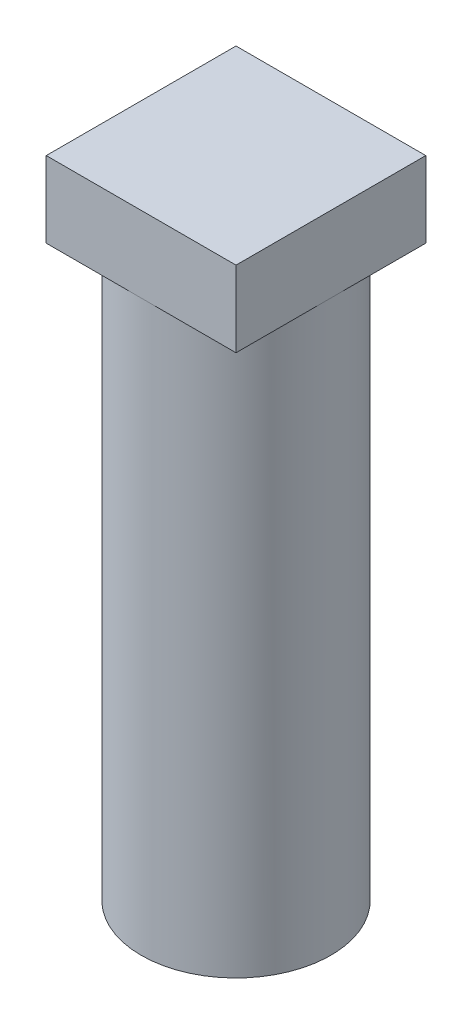
ISO-10303-21;
HEADER;
FILE_DESCRIPTION(('STEP AP214'),'2;1');
FILE_NAME('part.step','',(''),(''),'','','');
FILE_SCHEMA(('AUTOMOTIVE_DESIGN { 1 0 10303 214 1 1 1 1 }'));
ENDSEC;
DATA;
#1=APPLICATION_CONTEXT('core data for automotive mechanical design processes');
#2=APPLICATION_PROTOCOL_DEFINITION('international standard','automotive_design',2000,#1);
#3=PRODUCT_CONTEXT('',#1,'mechanical');
#4=PRODUCT('Part','Part','',(#3));
#5=PRODUCT_RELATED_PRODUCT_CATEGORY('part','',(#4));
#6=PRODUCT_DEFINITION_FORMATION('','',#4);
#7=PRODUCT_DEFINITION_CONTEXT('part definition',#1,'design');
#8=PRODUCT_DEFINITION('design','',#6,#7);
#9=PRODUCT_DEFINITION_SHAPE('','',#8);
#10=(LENGTH_UNIT() NAMED_UNIT(*) SI_UNIT(.MILLI.,.METRE.));
#11=(NAMED_UNIT(*) PLANE_ANGLE_UNIT() SI_UNIT($,.RADIAN.));
#12=(NAMED_UNIT(*) SI_UNIT($,.STERADIAN.) SOLID_ANGLE_UNIT());
#13=UNCERTAINTY_MEASURE_WITH_UNIT(LENGTH_MEASURE(1.E-05),#10,'distance_accuracy_value','');
#14=(GEOMETRIC_REPRESENTATION_CONTEXT(3) GLOBAL_UNCERTAINTY_ASSIGNED_CONTEXT((#13)) GLOBAL_UNIT_ASSIGNED_CONTEXT((#10,
#11,#12)) REPRESENTATION_CONTEXT('',''));
#15=CARTESIAN_POINT('',(0.,0.,0.));
#16=DIRECTION('',(0.,0.,1.));
#17=DIRECTION('',(1.,0.,0.));
#18=AXIS2_PLACEMENT_3D('',#15,#16,#17);
#19=CARTESIAN_POINT('',(0.,15.,0.));
#20=DIRECTION('',(0.,-1.,0.));
#21=DIRECTION('',(0.,0.,-1.));
#22=AXIS2_PLACEMENT_3D('',#19,#20,#21);
#23=CYLINDRICAL_SURFACE('',#22,2.5);
#24=CARTESIAN_POINT('',(0.,15.,0.));
#25=DIRECTION('',(0.,1.,0.));
#26=DIRECTION('',(0.,0.,1.));
#27=AXIS2_PLACEMENT_3D('',#24,#25,#26);
#28=CIRCLE('',#27,2.5);
#29=CARTESIAN_POINT('',(0.,15.,2.5));
#30=VERTEX_POINT('',#29);
#31=CARTESIAN_POINT('',(2.5,15.,0.));
#32=VERTEX_POINT('',#31);
#33=EDGE_CURVE('E11',#30,#32,#28,.T.);
#34=ORIENTED_EDGE('',*,*,#33,.F.);
#35=CARTESIAN_POINT('',(-2.5,15.,0.));
#36=VERTEX_POINT('',#35);
#37=EDGE_CURVE('E53',#36,#30,#28,.T.);
#38=ORIENTED_EDGE('',*,*,#37,.F.);
#39=CARTESIAN_POINT('',(0.,15.,-2.5));
#40=VERTEX_POINT('',#39);
#41=EDGE_CURVE('E63',#40,#36,#28,.T.);
#42=ORIENTED_EDGE('',*,*,#41,.F.);
#43=EDGE_CURVE('E52',#32,#40,#28,.T.);
#44=ORIENTED_EDGE('',*,*,#43,.F.);
#45=EDGE_LOOP('',(#34,#38,#42,#44));
#46=FACE_BOUND('',#45,.T.);
#47=CARTESIAN_POINT('',(0.,0.,0.));
#48=DIRECTION('',(0.,1.,0.));
#49=DIRECTION('',(0.,0.,1.));
#50=AXIS2_PLACEMENT_3D('',#47,#48,#49);
#51=CIRCLE('',#50,2.5);
#52=CARTESIAN_POINT('',(0.,0.,2.5));
#53=VERTEX_POINT('',#52);
#54=EDGE_CURVE('E46',#53,#53,#51,.T.);
#55=ORIENTED_EDGE('',*,*,#54,.T.);
#56=EDGE_LOOP('',(#55));
#57=FACE_BOUND('',#56,.T.);
#58=ADVANCED_FACE('F43',(#46,#57),#23,.T.);
#59=CARTESIAN_POINT('',(0.,0.,0.));
#60=DIRECTION('',(0.,1.,0.));
#61=DIRECTION('',(0.,0.,1.));
#62=AXIS2_PLACEMENT_3D('',#59,#60,#61);
#63=PLANE('',#62);
#64=ORIENTED_EDGE('',*,*,#54,.F.);
#65=EDGE_LOOP('',(#64));
#66=FACE_BOUND('',#65,.T.);
#67=ADVANCED_FACE('F193',(#66),#63,.F.);
#68=CARTESIAN_POINT('',(0.,15.,0.));
#69=DIRECTION('',(0.,1.,0.));
#70=DIRECTION('',(0.,0.,1.));
#71=AXIS2_PLACEMENT_3D('',#68,#69,#70);
#72=PLANE('',#71);
#73=DIRECTION('',(1.,0.,0.));
#74=VECTOR('',#73,1.);
#75=CARTESIAN_POINT('',(-2.5,15.,2.5));
#76=LINE('',#75,#74);
#77=CARTESIAN_POINT('',(2.5,15.,2.5));
#78=VERTEX_POINT('',#77);
#79=EDGE_CURVE('E141',#30,#78,#76,.T.);
#80=ORIENTED_EDGE('',*,*,#79,.F.);
#81=ORIENTED_EDGE('',*,*,#33,.T.);
#82=DIRECTION('',(0.,0.,-1.));
#83=VECTOR('',#82,1.);
#84=CARTESIAN_POINT('',(2.5,15.,-2.5));
#85=LINE('',#84,#83);
#86=EDGE_CURVE('E151',#78,#32,#85,.T.);
#87=ORIENTED_EDGE('',*,*,#86,.F.);
#88=EDGE_LOOP('',(#80,#81,#87));
#89=FACE_BOUND('',#88,.T.);
#90=ADVANCED_FACE('F167',(#89),#72,.F.);
#91=CARTESIAN_POINT('',(2.5,15.,-2.5));
#92=VERTEX_POINT('',#91);
#93=EDGE_CURVE('E122',#32,#92,#85,.T.);
#94=ORIENTED_EDGE('',*,*,#93,.F.);
#95=ORIENTED_EDGE('',*,*,#43,.T.);
#96=DIRECTION('',(-1.,0.,0.));
#97=VECTOR('',#96,1.);
#98=CARTESIAN_POINT('',(-2.5,15.,-2.5));
#99=LINE('',#98,#97);
#100=EDGE_CURVE('E147',#92,#40,#99,.T.);
#101=ORIENTED_EDGE('',*,*,#100,.F.);
#102=EDGE_LOOP('',(#94,#95,#101));
#103=FACE_BOUND('',#102,.T.);
#104=ADVANCED_FACE('F169',(#103),#72,.F.);
#105=CARTESIAN_POINT('',(-2.5,15.,-2.5));
#106=VERTEX_POINT('',#105);
#107=EDGE_CURVE('E150',#40,#106,#99,.T.);
#108=ORIENTED_EDGE('',*,*,#107,.F.);
#109=ORIENTED_EDGE('',*,*,#41,.T.);
#110=DIRECTION('',(0.,0.,1.));
#111=VECTOR('',#110,1.);
#112=CARTESIAN_POINT('',(-2.5,15.,-2.5));
#113=LINE('',#112,#111);
#114=EDGE_CURVE('E142',#106,#36,#113,.T.);
#115=ORIENTED_EDGE('',*,*,#114,.F.);
#116=EDGE_LOOP('',(#108,#109,#115));
#117=FACE_BOUND('',#116,.T.);
#118=ADVANCED_FACE('F177',(#117),#72,.F.);
#119=CARTESIAN_POINT('',(-2.5,15.,2.5));
#120=VERTEX_POINT('',#119);
#121=EDGE_CURVE('E146',#36,#120,#113,.T.);
#122=ORIENTED_EDGE('',*,*,#121,.F.);
#123=ORIENTED_EDGE('',*,*,#37,.T.);
#124=EDGE_CURVE('E117',#120,#30,#76,.T.);
#125=ORIENTED_EDGE('',*,*,#124,.F.);
#126=EDGE_LOOP('',(#122,#123,#125));
#127=FACE_BOUND('',#126,.T.);
#128=ADVANCED_FACE('F180',(#127),#72,.F.);
#129=CARTESIAN_POINT('',(2.5,17.,-2.5));
#130=DIRECTION('',(-1.,0.,0.));
#131=DIRECTION('',(0.,0.,1.));
#132=AXIS2_PLACEMENT_3D('',#129,#130,#131);
#133=PLANE('',#132);
#134=ORIENTED_EDGE('',*,*,#86,.T.);
#135=ORIENTED_EDGE('',*,*,#93,.T.);
#136=DIRECTION('',(0.,-1.,0.));
#137=VECTOR('',#136,1.);
#138=CARTESIAN_POINT('',(2.5,17.,-2.5));
#139=LINE('',#138,#137);
#140=CARTESIAN_POINT('',(2.5,17.,-2.5));
#141=VERTEX_POINT('',#140);
#142=EDGE_CURVE('E100',#141,#92,#139,.T.);
#143=ORIENTED_EDGE('',*,*,#142,.F.);
#144=DIRECTION('',(0.,0.,-1.));
#145=VECTOR('',#144,1.);
#146=CARTESIAN_POINT('',(2.5,17.,-2.5));
#147=LINE('',#146,#145);
#148=CARTESIAN_POINT('',(2.5,17.,2.5));
#149=VERTEX_POINT('',#148);
#150=EDGE_CURVE('E107',#149,#141,#147,.T.);
#151=ORIENTED_EDGE('',*,*,#150,.F.);
#152=DIRECTION('',(0.,-1.,0.));
#153=VECTOR('',#152,1.);
#154=CARTESIAN_POINT('',(2.5,17.,2.5));
#155=LINE('',#154,#153);
#156=EDGE_CURVE('E135',#149,#78,#155,.T.);
#157=ORIENTED_EDGE('',*,*,#156,.T.);
#158=EDGE_LOOP('',(#134,#135,#143,#151,#157));
#159=FACE_BOUND('',#158,.T.);
#160=ADVANCED_FACE('F120',(#159),#133,.F.);
#161=CARTESIAN_POINT('',(-2.5,17.,-2.5));
#162=DIRECTION('',(0.,0.,1.));
#163=DIRECTION('',(1.,0.,0.));
#164=AXIS2_PLACEMENT_3D('',#161,#162,#163);
#165=PLANE('',#164);
#166=ORIENTED_EDGE('',*,*,#100,.T.);
#167=ORIENTED_EDGE('',*,*,#107,.T.);
#168=DIRECTION('',(0.,-1.,0.));
#169=VECTOR('',#168,1.);
#170=CARTESIAN_POINT('',(-2.5,17.,-2.5));
#171=LINE('',#170,#169);
#172=CARTESIAN_POINT('',(-2.5,17.,-2.5));
#173=VERTEX_POINT('',#172);
#174=EDGE_CURVE('E102',#173,#106,#171,.T.);
#175=ORIENTED_EDGE('',*,*,#174,.F.);
#176=DIRECTION('',(-1.,0.,0.));
#177=VECTOR('',#176,1.);
#178=CARTESIAN_POINT('',(-2.5,17.,-2.5));
#179=LINE('',#178,#177);
#180=EDGE_CURVE('E95',#141,#173,#179,.T.);
#181=ORIENTED_EDGE('',*,*,#180,.F.);
#182=ORIENTED_EDGE('',*,*,#142,.T.);
#183=EDGE_LOOP('',(#166,#167,#175,#181,#182));
#184=FACE_BOUND('',#183,.T.);
#185=ADVANCED_FACE('F98',(#184),#165,.F.);
#186=CARTESIAN_POINT('',(-2.5,17.,-2.5));
#187=DIRECTION('',(1.,0.,0.));
#188=DIRECTION('',(0.,0.,-1.));
#189=AXIS2_PLACEMENT_3D('',#186,#187,#188);
#190=PLANE('',#189);
#191=ORIENTED_EDGE('',*,*,#114,.T.);
#192=ORIENTED_EDGE('',*,*,#121,.T.);
#193=DIRECTION('',(0.,-1.,0.));
#194=VECTOR('',#193,1.);
#195=CARTESIAN_POINT('',(-2.5,17.,2.5));
#196=LINE('',#195,#194);
#197=CARTESIAN_POINT('',(-2.5,17.,2.5));
#198=VERTEX_POINT('',#197);
#199=EDGE_CURVE('E129',#198,#120,#196,.T.);
#200=ORIENTED_EDGE('',*,*,#199,.F.);
#201=DIRECTION('',(0.,0.,1.));
#202=VECTOR('',#201,1.);
#203=CARTESIAN_POINT('',(-2.5,17.,-2.5));
#204=LINE('',#203,#202);
#205=EDGE_CURVE('E106',#173,#198,#204,.T.);
#206=ORIENTED_EDGE('',*,*,#205,.F.);
#207=ORIENTED_EDGE('',*,*,#174,.T.);
#208=EDGE_LOOP('',(#191,#192,#200,#206,#207));
#209=FACE_BOUND('',#208,.T.);
#210=ADVANCED_FACE('F159',(#209),#190,.F.);
#211=CARTESIAN_POINT('',(-2.5,17.,2.5));
#212=DIRECTION('',(0.,0.,-1.));
#213=DIRECTION('',(-1.,0.,0.));
#214=AXIS2_PLACEMENT_3D('',#211,#212,#213);
#215=PLANE('',#214);
#216=ORIENTED_EDGE('',*,*,#124,.T.);
#217=ORIENTED_EDGE('',*,*,#79,.T.);
#218=ORIENTED_EDGE('',*,*,#156,.F.);
#219=DIRECTION('',(1.,0.,0.));
#220=VECTOR('',#219,1.);
#221=CARTESIAN_POINT('',(-2.5,17.,2.5));
#222=LINE('',#221,#220);
#223=EDGE_CURVE('E112',#198,#149,#222,.T.);
#224=ORIENTED_EDGE('',*,*,#223,.F.);
#225=ORIENTED_EDGE('',*,*,#199,.T.);
#226=EDGE_LOOP('',(#216,#217,#218,#224,#225));
#227=FACE_BOUND('',#226,.T.);
#228=ADVANCED_FACE('F163',(#227),#215,.F.);
#229=CARTESIAN_POINT('',(0.,17.,0.));
#230=DIRECTION('',(0.,1.,0.));
#231=DIRECTION('',(0.,0.,1.));
#232=AXIS2_PLACEMENT_3D('',#229,#230,#231);
#233=PLANE('',#232);
#234=ORIENTED_EDGE('',*,*,#150,.T.);
#235=ORIENTED_EDGE('',*,*,#180,.T.);
#236=ORIENTED_EDGE('',*,*,#205,.T.);
#237=ORIENTED_EDGE('',*,*,#223,.T.);
#238=EDGE_LOOP('',(#234,#235,#236,#237));
#239=FACE_BOUND('',#238,.T.);
#240=ADVANCED_FACE('F110',(#239),#233,.T.);
#241=CLOSED_SHELL('',(#58,#67,#90,#104,#118,#128,#160,#185,#210,#228,#240));
#242=MANIFOLD_SOLID_BREP('B2',#241);
#243=ADVANCED_BREP_SHAPE_REPRESENTATION('',(#18,#242),#14);
#244=SHAPE_DEFINITION_REPRESENTATION(#9,#243);
ENDSEC;
END-ISO-10303-21;
